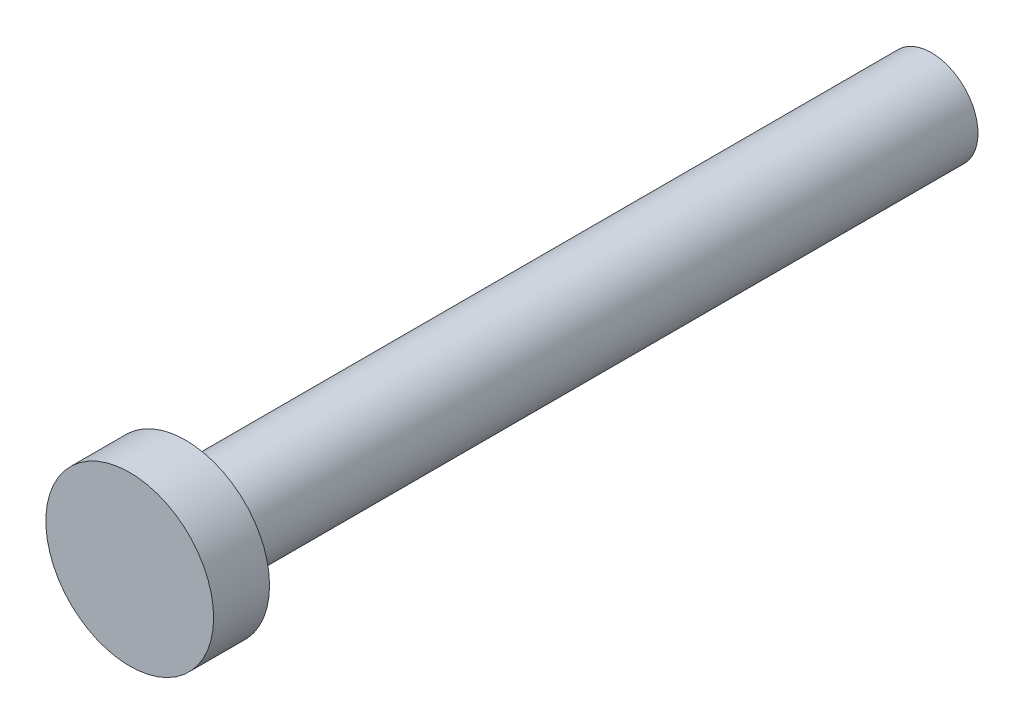
ISO-10303-21;
HEADER;
FILE_DESCRIPTION(('STEP AP214'),'2;1');
FILE_NAME('part.step','',(''),(''),'','','');
FILE_SCHEMA(('AUTOMOTIVE_DESIGN { 1 0 10303 214 1 1 1 1 }'));
ENDSEC;
DATA;
#1=APPLICATION_CONTEXT('core data for automotive mechanical design processes');
#2=APPLICATION_PROTOCOL_DEFINITION('international standard','automotive_design',2000,#1);
#3=PRODUCT_CONTEXT('',#1,'mechanical');
#4=PRODUCT('Part','Part','',(#3));
#5=PRODUCT_RELATED_PRODUCT_CATEGORY('part','',(#4));
#6=PRODUCT_DEFINITION_FORMATION('','',#4);
#7=PRODUCT_DEFINITION_CONTEXT('part definition',#1,'design');
#8=PRODUCT_DEFINITION('design','',#6,#7);
#9=PRODUCT_DEFINITION_SHAPE('','',#8);
#10=(LENGTH_UNIT() NAMED_UNIT(*) SI_UNIT(.MILLI.,.METRE.));
#11=(NAMED_UNIT(*) PLANE_ANGLE_UNIT() SI_UNIT($,.RADIAN.));
#12=(NAMED_UNIT(*) SI_UNIT($,.STERADIAN.) SOLID_ANGLE_UNIT());
#13=UNCERTAINTY_MEASURE_WITH_UNIT(LENGTH_MEASURE(1.E-05),#10,'distance_accuracy_value','');
#14=(GEOMETRIC_REPRESENTATION_CONTEXT(3) GLOBAL_UNCERTAINTY_ASSIGNED_CONTEXT((#13)) GLOBAL_UNIT_ASSIGNED_CONTEXT((#10,
#11,#12)) REPRESENTATION_CONTEXT('',''));
#15=CARTESIAN_POINT('',(0.,0.,0.));
#16=DIRECTION('',(0.,0.,1.));
#17=DIRECTION('',(1.,0.,0.));
#18=AXIS2_PLACEMENT_3D('',#15,#16,#17);
#19=CARTESIAN_POINT('',(0.,0.,40.));
#20=DIRECTION('',(0.,0.,-1.));
#21=DIRECTION('',(-1.,0.,0.));
#22=AXIS2_PLACEMENT_3D('',#19,#20,#21);
#23=CYLINDRICAL_SURFACE('',#22,2.5);
#24=CARTESIAN_POINT('',(0.,0.,40.));
#25=DIRECTION('',(0.,0.,1.));
#26=DIRECTION('',(1.,0.,0.));
#27=AXIS2_PLACEMENT_3D('',#24,#25,#26);
#28=CIRCLE('',#27,2.5);
#29=CARTESIAN_POINT('',(2.5,0.,40.));
#30=VERTEX_POINT('',#29);
#31=EDGE_CURVE('E10',#30,#30,#28,.T.);
#32=ORIENTED_EDGE('',*,*,#31,.F.);
#33=EDGE_LOOP('',(#32));
#34=FACE_BOUND('',#33,.T.);
#35=CARTESIAN_POINT('',(0.,0.,0.));
#36=DIRECTION('',(0.,0.,1.));
#37=DIRECTION('',(1.,0.,0.));
#38=AXIS2_PLACEMENT_3D('',#35,#36,#37);
#39=CIRCLE('',#38,2.5);
#40=CARTESIAN_POINT('',(2.5,0.,0.));
#41=VERTEX_POINT('',#40);
#42=EDGE_CURVE('E40',#41,#41,#39,.T.);
#43=ORIENTED_EDGE('',*,*,#42,.T.);
#44=EDGE_LOOP('',(#43));
#45=FACE_BOUND('',#44,.T.);
#46=ADVANCED_FACE('F37',(#34,#45),#23,.T.);
#47=CARTESIAN_POINT('',(0.,0.,0.));
#48=DIRECTION('',(0.,0.,1.));
#49=DIRECTION('',(1.,0.,0.));
#50=AXIS2_PLACEMENT_3D('',#47,#48,#49);
#51=PLANE('',#50);
#52=ORIENTED_EDGE('',*,*,#42,.F.);
#53=EDGE_LOOP('',(#52));
#54=FACE_BOUND('',#53,.T.);
#55=ADVANCED_FACE('F60',(#54),#51,.F.);
#56=CARTESIAN_POINT('',(0.,0.,43.));
#57=DIRECTION('',(0.,0.,-1.));
#58=DIRECTION('',(-1.,0.,0.));
#59=AXIS2_PLACEMENT_3D('',#56,#57,#58);
#60=CYLINDRICAL_SURFACE('',#59,4.5);
#61=CARTESIAN_POINT('',(0.,0.,43.));
#62=DIRECTION('',(0.,0.,1.));
#63=DIRECTION('',(1.,0.,0.));
#64=AXIS2_PLACEMENT_3D('',#61,#62,#63);
#65=CIRCLE('',#64,4.5);
#66=CARTESIAN_POINT('',(4.5,0.,43.));
#67=VERTEX_POINT('',#66);
#68=EDGE_CURVE('E47',#67,#67,#65,.T.);
#69=ORIENTED_EDGE('',*,*,#68,.F.);
#70=EDGE_LOOP('',(#69));
#71=FACE_BOUND('',#70,.T.);
#72=CARTESIAN_POINT('',(0.,0.,40.));
#73=DIRECTION('',(0.,0.,1.));
#74=DIRECTION('',(1.,0.,0.));
#75=AXIS2_PLACEMENT_3D('',#72,#73,#74);
#76=CIRCLE('',#75,4.5);
#77=CARTESIAN_POINT('',(4.5,0.,40.));
#78=VERTEX_POINT('',#77);
#79=EDGE_CURVE('E49',#78,#78,#76,.T.);
#80=ORIENTED_EDGE('',*,*,#79,.T.);
#81=EDGE_LOOP('',(#80));
#82=FACE_BOUND('',#81,.T.);
#83=ADVANCED_FACE('F57',(#71,#82),#60,.T.);
#84=CARTESIAN_POINT('',(0.,0.,43.));
#85=DIRECTION('',(0.,0.,1.));
#86=DIRECTION('',(1.,0.,0.));
#87=AXIS2_PLACEMENT_3D('',#84,#85,#86);
#88=PLANE('',#87);
#89=ORIENTED_EDGE('',*,*,#68,.T.);
#90=EDGE_LOOP('',(#89));
#91=FACE_BOUND('',#90,.T.);
#92=ADVANCED_FACE('F55',(#91),#88,.T.);
#93=CARTESIAN_POINT('',(0.,0.,40.));
#94=DIRECTION('',(0.,0.,1.));
#95=DIRECTION('',(1.,0.,0.));
#96=AXIS2_PLACEMENT_3D('',#93,#94,#95);
#97=PLANE('',#96);
#98=ORIENTED_EDGE('',*,*,#31,.T.);
#99=EDGE_LOOP('',(#98));
#100=FACE_BOUND('',#99,.T.);
#101=ORIENTED_EDGE('',*,*,#79,.F.);
#102=EDGE_LOOP('',(#101));
#103=FACE_BOUND('',#102,.T.);
#104=ADVANCED_FACE('F64',(#100,#103),#97,.F.);
#105=CLOSED_SHELL('',(#46,#55,#83,#92,#104));
#106=MANIFOLD_SOLID_BREP('B2',#105);
#107=ADVANCED_BREP_SHAPE_REPRESENTATION('',(#18,#106),#14);
#108=SHAPE_DEFINITION_REPRESENTATION(#9,#107);
ENDSEC;
END-ISO-10303-21;
